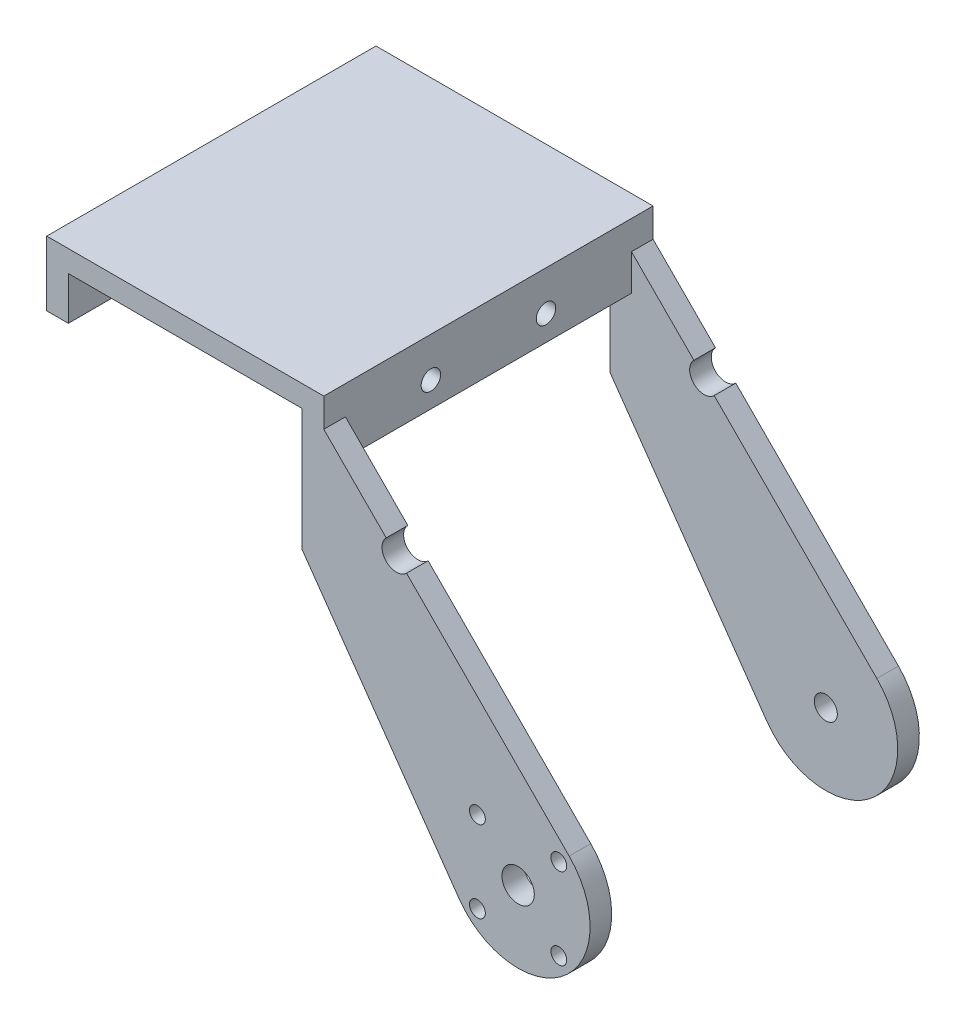
ISO-10303-21;
HEADER;
FILE_DESCRIPTION(('STEP AP214'),'2;1');
FILE_NAME('part.step','',(''),(''),'','','');
FILE_SCHEMA(('AUTOMOTIVE_DESIGN { 1 0 10303 214 1 1 1 1 }'));
ENDSEC;
DATA;
#1=APPLICATION_CONTEXT('core data for automotive mechanical design processes');
#2=APPLICATION_PROTOCOL_DEFINITION('international standard','automotive_design',2000,#1);
#3=PRODUCT_CONTEXT('',#1,'mechanical');
#4=PRODUCT('Part','Part','',(#3));
#5=PRODUCT_RELATED_PRODUCT_CATEGORY('part','',(#4));
#6=PRODUCT_DEFINITION_FORMATION('','',#4);
#7=PRODUCT_DEFINITION_CONTEXT('part definition',#1,'design');
#8=PRODUCT_DEFINITION('design','',#6,#7);
#9=PRODUCT_DEFINITION_SHAPE('','',#8);
#10=(LENGTH_UNIT() NAMED_UNIT(*) SI_UNIT(.MILLI.,.METRE.));
#11=(NAMED_UNIT(*) PLANE_ANGLE_UNIT() SI_UNIT($,.RADIAN.));
#12=(NAMED_UNIT(*) SI_UNIT($,.STERADIAN.) SOLID_ANGLE_UNIT());
#13=UNCERTAINTY_MEASURE_WITH_UNIT(LENGTH_MEASURE(1.E-05),#10,'distance_accuracy_value','');
#14=(GEOMETRIC_REPRESENTATION_CONTEXT(3) GLOBAL_UNCERTAINTY_ASSIGNED_CONTEXT((#13)) GLOBAL_UNIT_ASSIGNED_CONTEXT((#10,
#11,#12)) REPRESENTATION_CONTEXT('',''));
#15=CARTESIAN_POINT('',(0.,0.,0.));
#16=DIRECTION('',(0.,0.,1.));
#17=DIRECTION('',(1.,0.,0.));
#18=AXIS2_PLACEMENT_3D('',#15,#16,#17);
#19=CARTESIAN_POINT('',(19.25,-4.,19.875));
#20=DIRECTION('',(0.709355998899242,0.704850386128616,0.));
#21=DIRECTION('',(-0.704850386128616,0.709355998899242,0.));
#22=AXIS2_PLACEMENT_3D('',#19,#20,#21);
#23=PLANE('',#22);
#24=DIRECTION('',(0.,0.,1.));
#25=VECTOR('',#24,1.);
#26=CARTESIAN_POINT('',(27.9249333549964,-12.7303861025267,-27.7034211788351));
#27=LINE('',#26,#25);
#28=CARTESIAN_POINT('',(27.9249333549964,-12.7303861025267,19.875));
#29=VERTEX_POINT('',#28);
#30=CARTESIAN_POINT('',(27.9249333549964,-12.7303861025267,22.875));
#31=VERTEX_POINT('',#30);
#32=EDGE_CURVE('E173',#29,#31,#27,.T.);
#33=ORIENTED_EDGE('',*,*,#32,.F.);
#34=DIRECTION('',(-0.704850386128616,0.709355998899242,0.));
#35=VECTOR('',#34,1.);
#36=CARTESIAN_POINT('',(19.25,-4.,19.875));
#37=LINE('',#36,#35);
#38=CARTESIAN_POINT('',(19.25,-4.,19.875));
#39=VERTEX_POINT('',#38);
#40=EDGE_CURVE('E426',#29,#39,#37,.T.);
#41=ORIENTED_EDGE('',*,*,#40,.T.);
#42=DIRECTION('',(0.,0.,1.));
#43=VECTOR('',#42,1.);
#44=CARTESIAN_POINT('',(19.25,-4.,19.875));
#45=LINE('',#44,#43);
#46=CARTESIAN_POINT('',(19.25,-4.,22.875));
#47=VERTEX_POINT('',#46);
#48=EDGE_CURVE('E193',#39,#47,#45,.T.);
#49=ORIENTED_EDGE('',*,*,#48,.T.);
#50=DIRECTION('',(-0.704850386128616,0.709355998899242,0.));
#51=VECTOR('',#50,1.);
#52=CARTESIAN_POINT('',(19.25,-4.,22.875));
#53=LINE('',#52,#51);
#54=EDGE_CURVE('E185',#31,#47,#53,.T.);
#55=ORIENTED_EDGE('',*,*,#54,.F.);
#56=EDGE_LOOP('',(#33,#41,#49,#55));
#57=FACE_BOUND('',#56,.T.);
#58=ADVANCED_FACE('F36',(#57),#23,.T.);
#59=CARTESIAN_POINT('',(19.25,-4.,-19.875));
#60=DIRECTION('',(-0.709355998899242,-0.704850386128616,0.));
#61=DIRECTION('',(0.704850386128616,-0.709355998899242,0.));
#62=AXIS2_PLACEMENT_3D('',#59,#60,#61);
#63=PLANE('',#62);
#64=DIRECTION('',(-0.704850386128616,0.709355998899242,0.));
#65=VECTOR('',#64,1.);
#66=CARTESIAN_POINT('',(19.25,-4.,-22.875));
#67=LINE('',#66,#65);
#68=CARTESIAN_POINT('',(53.3435599889924,-38.3114961387138,-22.875));
#69=VERTEX_POINT('',#68);
#70=CARTESIAN_POINT('',(30.7443348995109,-15.5678100981236,-22.875));
#71=VERTEX_POINT('',#70);
#72=EDGE_CURVE('E404',#69,#71,#67,.T.);
#73=ORIENTED_EDGE('',*,*,#72,.T.);
#74=DIRECTION('',(0.,0.,1.));
#75=VECTOR('',#74,1.);
#76=CARTESIAN_POINT('',(30.7443348995109,-15.5678100981236,-27.7034211788351));
#77=LINE('',#76,#75);
#78=CARTESIAN_POINT('',(30.7443348995109,-15.5678100981236,-19.875));
#79=VERTEX_POINT('',#78);
#80=EDGE_CURVE('E349',#71,#79,#77,.T.);
#81=ORIENTED_EDGE('',*,*,#80,.T.);
#82=DIRECTION('',(-0.704850386128616,0.709355998899242,0.));
#83=VECTOR('',#82,1.);
#84=CARTESIAN_POINT('',(19.25,-4.,-19.875));
#85=LINE('',#84,#83);
#86=CARTESIAN_POINT('',(53.3435599889924,-38.3114961387138,-19.875));
#87=VERTEX_POINT('',#86);
#88=EDGE_CURVE('E395',#87,#79,#85,.T.);
#89=ORIENTED_EDGE('',*,*,#88,.F.);
#90=DIRECTION('',(0.,0.,-1.));
#91=VECTOR('',#90,1.);
#92=CARTESIAN_POINT('',(53.3435599889924,-38.3114961387138,-19.875));
#93=LINE('',#92,#91);
#94=EDGE_CURVE('E415',#87,#69,#93,.T.);
#95=ORIENTED_EDGE('',*,*,#94,.T.);
#96=EDGE_LOOP('',(#73,#81,#89,#95));
#97=FACE_BOUND('',#96,.T.);
#98=ADVANCED_FACE('F322',(#97),#63,.F.);
#99=CARTESIAN_POINT('',(19.25,-9.,0.));
#100=DIRECTION('',(-1.,0.,0.));
#101=DIRECTION('',(0.,0.,1.));
#102=AXIS2_PLACEMENT_3D('',#99,#100,#101);
#103=PLANE('',#102);
#104=CARTESIAN_POINT('',(19.25,-5.5,-8.));
#105=DIRECTION('',(-1.,0.,0.));
#106=DIRECTION('',(0.,0.,1.));
#107=AXIS2_PLACEMENT_3D('',#104,#105,#106);
#108=CIRCLE('',#107,1.35);
#109=CARTESIAN_POINT('',(19.25,-5.5,-6.65));
#110=VERTEX_POINT('',#109);
#111=EDGE_CURVE('E246',#110,#110,#108,.F.);
#112=ORIENTED_EDGE('',*,*,#111,.F.);
#113=EDGE_LOOP('',(#112));
#114=FACE_BOUND('',#113,.T.);
#115=CARTESIAN_POINT('',(19.25,-5.5,8.));
#116=DIRECTION('',(-1.,0.,0.));
#117=DIRECTION('',(0.,0.,1.));
#118=AXIS2_PLACEMENT_3D('',#115,#116,#117);
#119=CIRCLE('',#118,1.35);
#120=CARTESIAN_POINT('',(19.25,-5.5,9.35));
#121=VERTEX_POINT('',#120);
#122=EDGE_CURVE('E234',#121,#121,#119,.T.);
#123=ORIENTED_EDGE('',*,*,#122,.T.);
#124=EDGE_LOOP('',(#123));
#125=FACE_BOUND('',#124,.T.);
#126=DIRECTION('',(0.,0.,-1.));
#127=VECTOR('',#126,1.);
#128=CARTESIAN_POINT('',(19.25,-4.,-19.875));
#129=LINE('',#128,#127);
#130=CARTESIAN_POINT('',(19.25,-4.,-19.875));
#131=VERTEX_POINT('',#130);
#132=CARTESIAN_POINT('',(19.25,-4.,-22.875));
#133=VERTEX_POINT('',#132);
#134=EDGE_CURVE('E403',#131,#133,#129,.T.);
#135=ORIENTED_EDGE('',*,*,#134,.T.);
#136=DIRECTION('',(0.,1.,0.));
#137=VECTOR('',#136,1.);
#138=CARTESIAN_POINT('',(19.25,-20.,-22.875));
#139=LINE('',#138,#137);
#140=CARTESIAN_POINT('',(19.25,0.,-22.875));
#141=VERTEX_POINT('',#140);
#142=EDGE_CURVE('E223',#133,#141,#139,.T.);
#143=ORIENTED_EDGE('',*,*,#142,.T.);
#144=DIRECTION('',(0.,0.,1.));
#145=VECTOR('',#144,1.);
#146=CARTESIAN_POINT('',(19.25,0.,0.));
#147=LINE('',#146,#145);
#148=CARTESIAN_POINT('',(19.25,0.,22.875));
#149=VERTEX_POINT('',#148);
#150=EDGE_CURVE('E255',#141,#149,#147,.T.);
#151=ORIENTED_EDGE('',*,*,#150,.T.);
#152=DIRECTION('',(0.,1.,0.));
#153=VECTOR('',#152,1.);
#154=CARTESIAN_POINT('',(19.25,-20.,22.875));
#155=LINE('',#154,#153);
#156=EDGE_CURVE('E213',#47,#149,#155,.T.);
#157=ORIENTED_EDGE('',*,*,#156,.F.);
#158=ORIENTED_EDGE('',*,*,#48,.F.);
#159=DIRECTION('',(0.,1.,0.));
#160=VECTOR('',#159,1.);
#161=CARTESIAN_POINT('',(19.25,-9.,19.875));
#162=LINE('',#161,#160);
#163=CARTESIAN_POINT('',(19.25,-9.,19.875));
#164=VERTEX_POINT('',#163);
#165=EDGE_CURVE('E202',#164,#39,#162,.T.);
#166=ORIENTED_EDGE('',*,*,#165,.F.);
#167=DIRECTION('',(0.,0.,1.));
#168=VECTOR('',#167,1.);
#169=CARTESIAN_POINT('',(19.25,-9.,0.));
#170=LINE('',#169,#168);
#171=CARTESIAN_POINT('',(19.25,-9.,-19.875));
#172=VERTEX_POINT('',#171);
#173=EDGE_CURVE('E258',#172,#164,#170,.T.);
#174=ORIENTED_EDGE('',*,*,#173,.F.);
#175=DIRECTION('',(0.,-1.,0.));
#176=VECTOR('',#175,1.);
#177=CARTESIAN_POINT('',(19.25,-9.,-19.875));
#178=LINE('',#177,#176);
#179=EDGE_CURVE('E414',#131,#172,#178,.T.);
#180=ORIENTED_EDGE('',*,*,#179,.F.);
#181=EDGE_LOOP('',(#135,#143,#151,#157,#158,#166,#174,#180));
#182=FACE_BOUND('',#181,.T.);
#183=ADVANCED_FACE('F328',(#114,#125,#182),#103,.F.);
#184=CARTESIAN_POINT('',(0.,-3.,22.875));
#185=DIRECTION('',(0.,0.,-1.));
#186=DIRECTION('',(-1.,0.,0.));
#187=AXIS2_PLACEMENT_3D('',#184,#185,#186);
#188=PLANE('',#187);
#189=CARTESIAN_POINT('',(51.9068542494925,-51.0168542494923,22.875));
#190=DIRECTION('',(0.,0.,1.));
#191=DIRECTION('',(0.,-1.,0.));
#192=AXIS2_PLACEMENT_3D('',#189,#190,#191);
#193=CIRCLE('',#192,1.1);
#194=CARTESIAN_POINT('',(51.9068542494925,-52.1168542494923,22.875));
#195=VERTEX_POINT('',#194);
#196=EDGE_CURVE('E358',#195,#195,#193,.T.);
#197=ORIENTED_EDGE('',*,*,#196,.F.);
#198=EDGE_LOOP('',(#197));
#199=FACE_BOUND('',#198,.T.);
#200=CARTESIAN_POINT('',(40.5931457505076,-39.7031457505077,22.875));
#201=DIRECTION('',(0.,0.,1.));
#202=DIRECTION('',(0.,1.,0.));
#203=AXIS2_PLACEMENT_3D('',#200,#201,#202);
#204=CIRCLE('',#203,1.1);
#205=CARTESIAN_POINT('',(40.5931457505076,-38.6031457505077,22.875));
#206=VERTEX_POINT('',#205);
#207=EDGE_CURVE('E366',#206,#206,#204,.T.);
#208=ORIENTED_EDGE('',*,*,#207,.F.);
#209=EDGE_LOOP('',(#208));
#210=FACE_BOUND('',#209,.T.);
#211=CARTESIAN_POINT('',(40.5931457505076,-51.0168542494924,22.875));
#212=DIRECTION('',(0.,0.,1.));
#213=DIRECTION('',(-1.,0.,0.));
#214=AXIS2_PLACEMENT_3D('',#211,#212,#213);
#215=CIRCLE('',#214,1.1);
#216=CARTESIAN_POINT('',(39.4931457505076,-51.0168542494924,22.875));
#217=VERTEX_POINT('',#216);
#218=EDGE_CURVE('E359',#217,#217,#215,.T.);
#219=ORIENTED_EDGE('',*,*,#218,.F.);
#220=EDGE_LOOP('',(#219));
#221=FACE_BOUND('',#220,.T.);
#222=CARTESIAN_POINT('',(46.25,-45.36,22.875));
#223=DIRECTION('',(0.,0.,1.));
#224=DIRECTION('',(1.,0.,0.));
#225=AXIS2_PLACEMENT_3D('',#222,#223,#224);
#226=CIRCLE('',#225,2.25);
#227=CARTESIAN_POINT('',(48.5,-45.36,22.875));
#228=VERTEX_POINT('',#227);
#229=EDGE_CURVE('E383',#228,#228,#226,.T.);
#230=ORIENTED_EDGE('',*,*,#229,.F.);
#231=EDGE_LOOP('',(#230));
#232=FACE_BOUND('',#231,.T.);
#233=CARTESIAN_POINT('',(51.9068542494924,-39.7031457505076,22.875));
#234=DIRECTION('',(0.,0.,1.));
#235=DIRECTION('',(1.,0.,0.));
#236=AXIS2_PLACEMENT_3D('',#233,#234,#235);
#237=CIRCLE('',#236,1.1);
#238=CARTESIAN_POINT('',(53.0068542494924,-39.7031457505076,22.875));
#239=VERTEX_POINT('',#238);
#240=EDGE_CURVE('E382',#239,#239,#237,.T.);
#241=ORIENTED_EDGE('',*,*,#240,.F.);
#242=EDGE_LOOP('',(#241));
#243=FACE_BOUND('',#242,.T.);
#244=CARTESIAN_POINT('',(53.3435599889924,-38.3114961387138,22.875));
#245=VERTEX_POINT('',#244);
#246=CARTESIAN_POINT('',(30.7443348995109,-15.5678100981236,22.875));
#247=VERTEX_POINT('',#246);
#248=EDGE_CURVE('E189',#245,#247,#53,.T.);
#249=ORIENTED_EDGE('',*,*,#248,.T.);
#250=CARTESIAN_POINT('',(29.3346341272536,-14.1490981003251,22.875));
#251=DIRECTION('',(0.,0.,1.));
#252=DIRECTION('',(1.,0.,0.));
#253=AXIS2_PLACEMENT_3D('',#250,#251,#252);
#254=CIRCLE('',#253,2.);
#255=EDGE_CURVE('E53',#31,#247,#254,.T.);
#256=ORIENTED_EDGE('',*,*,#255,.F.);
#257=ORIENTED_EDGE('',*,*,#54,.T.);
#258=ORIENTED_EDGE('',*,*,#156,.T.);
#259=DIRECTION('',(-1.,0.,0.));
#260=VECTOR('',#259,1.);
#261=CARTESIAN_POINT('',(0.,0.,22.875));
#262=LINE('',#261,#260);
#263=CARTESIAN_POINT('',(-19.25,0.,22.875));
#264=VERTEX_POINT('',#263);
#265=EDGE_CURVE('E40',#149,#264,#262,.T.);
#266=ORIENTED_EDGE('',*,*,#265,.T.);
#267=DIRECTION('',(0.,1.,0.));
#268=VECTOR('',#267,1.);
#269=CARTESIAN_POINT('',(-19.25,-9.,22.875));
#270=LINE('',#269,#268);
#271=CARTESIAN_POINT('',(-19.25,-9.,22.875));
#272=VERTEX_POINT('',#271);
#273=EDGE_CURVE('E287',#272,#264,#270,.T.);
#274=ORIENTED_EDGE('',*,*,#273,.F.);
#275=DIRECTION('',(-1.,0.,0.));
#276=VECTOR('',#275,1.);
#277=CARTESIAN_POINT('',(0.,-9.,22.875));
#278=LINE('',#277,#276);
#279=CARTESIAN_POINT('',(-16.25,-9.,22.875));
#280=VERTEX_POINT('',#279);
#281=EDGE_CURVE('E275',#280,#272,#278,.T.);
#282=ORIENTED_EDGE('',*,*,#281,.F.);
#283=DIRECTION('',(0.,1.,0.));
#284=VECTOR('',#283,1.);
#285=CARTESIAN_POINT('',(-16.25,-9.,22.875));
#286=LINE('',#285,#284);
#287=CARTESIAN_POINT('',(-16.25,-3.,22.875));
#288=VERTEX_POINT('',#287);
#289=EDGE_CURVE('E285',#280,#288,#286,.T.);
#290=ORIENTED_EDGE('',*,*,#289,.T.);
#291=DIRECTION('',(-1.,0.,0.));
#292=VECTOR('',#291,1.);
#293=CARTESIAN_POINT('',(0.,-3.,22.875));
#294=LINE('',#293,#292);
#295=CARTESIAN_POINT('',(16.25,-3.,22.875));
#296=VERTEX_POINT('',#295);
#297=EDGE_CURVE('E11',#296,#288,#294,.T.);
#298=ORIENTED_EDGE('',*,*,#297,.F.);
#299=DIRECTION('',(0.,1.,0.));
#300=VECTOR('',#299,1.);
#301=CARTESIAN_POINT('',(16.25,-20.,22.875));
#302=LINE('',#301,#300);
#303=CARTESIAN_POINT('',(16.25,-20.,22.875));
#304=VERTEX_POINT('',#303);
#305=EDGE_CURVE('E216',#304,#296,#302,.T.);
#306=ORIENTED_EDGE('',*,*,#305,.F.);
#307=DIRECTION('',(0.57419439641508,-0.818718996436214,0.));
#308=VECTOR('',#307,1.);
#309=CARTESIAN_POINT('',(16.25,-20.,22.875));
#310=LINE('',#309,#308);
#311=CARTESIAN_POINT('',(38.0628100356379,-51.1019439641508,22.875));
#312=VERTEX_POINT('',#311);
#313=EDGE_CURVE('E197',#304,#312,#310,.T.);
#314=ORIENTED_EDGE('',*,*,#313,.T.);
#315=CARTESIAN_POINT('',(46.25,-45.36,22.875));
#316=DIRECTION('',(0.,0.,1.));
#317=DIRECTION('',(1.,0.,0.));
#318=AXIS2_PLACEMENT_3D('',#315,#316,#317);
#319=CIRCLE('',#318,10.);
#320=EDGE_CURVE('E194',#312,#245,#319,.T.);
#321=ORIENTED_EDGE('',*,*,#320,.T.);
#322=EDGE_LOOP('',(#249,#256,#257,#258,#266,#274,#282,#290,#298,#306,#314,#321));
#323=FACE_BOUND('',#322,.T.);
#324=ADVANCED_FACE('F184',(#199,#210,#221,#232,#243,#323),#188,.F.);
#325=CARTESIAN_POINT('',(0.,-3.,-22.875));
#326=DIRECTION('',(0.,0.,-1.));
#327=DIRECTION('',(-1.,0.,0.));
#328=AXIS2_PLACEMENT_3D('',#325,#326,#327);
#329=PLANE('',#328);
#330=CARTESIAN_POINT('',(29.3346341272536,-14.1490981003251,-22.875));
#331=DIRECTION('',(0.,0.,-1.));
#332=DIRECTION('',(-1.,0.,0.));
#333=AXIS2_PLACEMENT_3D('',#330,#331,#332);
#334=CIRCLE('',#333,2.);
#335=CARTESIAN_POINT('',(27.9249333549964,-12.7303861025267,-22.875));
#336=VERTEX_POINT('',#335);
#337=EDGE_CURVE('E61',#336,#71,#334,.F.);
#338=ORIENTED_EDGE('',*,*,#337,.T.);
#339=ORIENTED_EDGE('',*,*,#72,.F.);
#340=CARTESIAN_POINT('',(46.25,-45.36,-22.875));
#341=DIRECTION('',(0.,0.,1.));
#342=DIRECTION('',(1.,0.,0.));
#343=AXIS2_PLACEMENT_3D('',#340,#341,#342);
#344=CIRCLE('',#343,10.);
#345=CARTESIAN_POINT('',(38.0628100356379,-51.1019439641508,-22.875));
#346=VERTEX_POINT('',#345);
#347=EDGE_CURVE('E407',#346,#69,#344,.T.);
#348=ORIENTED_EDGE('',*,*,#347,.F.);
#349=DIRECTION('',(0.57419439641508,-0.818718996436214,0.));
#350=VECTOR('',#349,1.);
#351=CARTESIAN_POINT('',(16.25,-20.,-22.875));
#352=LINE('',#351,#350);
#353=CARTESIAN_POINT('',(16.25,-20.,-22.875));
#354=VERTEX_POINT('',#353);
#355=EDGE_CURVE('E409',#354,#346,#352,.T.);
#356=ORIENTED_EDGE('',*,*,#355,.F.);
#357=DIRECTION('',(0.,1.,0.));
#358=VECTOR('',#357,1.);
#359=CARTESIAN_POINT('',(16.25,-20.,-22.875));
#360=LINE('',#359,#358);
#361=CARTESIAN_POINT('',(16.25,-3.,-22.875));
#362=VERTEX_POINT('',#361);
#363=EDGE_CURVE('E228',#354,#362,#360,.T.);
#364=ORIENTED_EDGE('',*,*,#363,.T.);
#365=DIRECTION('',(-1.,0.,0.));
#366=VECTOR('',#365,1.);
#367=CARTESIAN_POINT('',(0.,-3.,-22.875));
#368=LINE('',#367,#366);
#369=CARTESIAN_POINT('',(-16.25,-3.,-22.875));
#370=VERTEX_POINT('',#369);
#371=EDGE_CURVE('E294',#362,#370,#368,.T.);
#372=ORIENTED_EDGE('',*,*,#371,.T.);
#373=DIRECTION('',(0.,1.,0.));
#374=VECTOR('',#373,1.);
#375=CARTESIAN_POINT('',(-16.25,-9.,-22.875));
#376=LINE('',#375,#374);
#377=CARTESIAN_POINT('',(-16.25,-9.,-22.875));
#378=VERTEX_POINT('',#377);
#379=EDGE_CURVE('E282',#378,#370,#376,.T.);
#380=ORIENTED_EDGE('',*,*,#379,.F.);
#381=DIRECTION('',(-1.,0.,0.));
#382=VECTOR('',#381,1.);
#383=CARTESIAN_POINT('',(0.,-9.,-22.875));
#384=LINE('',#383,#382);
#385=CARTESIAN_POINT('',(-19.25,-9.,-22.875));
#386=VERTEX_POINT('',#385);
#387=EDGE_CURVE('E269',#378,#386,#384,.T.);
#388=ORIENTED_EDGE('',*,*,#387,.T.);
#389=DIRECTION('',(0.,1.,0.));
#390=VECTOR('',#389,1.);
#391=CARTESIAN_POINT('',(-19.25,-9.,-22.875));
#392=LINE('',#391,#390);
#393=CARTESIAN_POINT('',(-19.25,0.,-22.875));
#394=VERTEX_POINT('',#393);
#395=EDGE_CURVE('E279',#386,#394,#392,.T.);
#396=ORIENTED_EDGE('',*,*,#395,.T.);
#397=DIRECTION('',(-1.,0.,0.));
#398=VECTOR('',#397,1.);
#399=CARTESIAN_POINT('',(0.,0.,-22.875));
#400=LINE('',#399,#398);
#401=EDGE_CURVE('E284',#141,#394,#400,.T.);
#402=ORIENTED_EDGE('',*,*,#401,.F.);
#403=ORIENTED_EDGE('',*,*,#142,.F.);
#404=EDGE_CURVE('E390',#336,#133,#67,.T.);
#405=ORIENTED_EDGE('',*,*,#404,.F.);
#406=EDGE_LOOP('',(#338,#339,#348,#356,#364,#372,#380,#388,#396,#402,#403,#405));
#407=FACE_BOUND('',#406,.T.);
#408=CARTESIAN_POINT('',(46.25,-45.36,-22.875));
#409=DIRECTION('',(0.,0.,-1.));
#410=DIRECTION('',(-1.,0.,0.));
#411=AXIS2_PLACEMENT_3D('',#408,#409,#410);
#412=CIRCLE('',#411,1.6);
#413=CARTESIAN_POINT('',(44.65,-45.36,-22.875));
#414=VERTEX_POINT('',#413);
#415=EDGE_CURVE('E372',#414,#414,#412,.T.);
#416=ORIENTED_EDGE('',*,*,#415,.F.);
#417=EDGE_LOOP('',(#416));
#418=FACE_BOUND('',#417,.T.);
#419=ADVANCED_FACE('F38',(#407,#418),#329,.T.);
#420=CARTESIAN_POINT('',(0.,-3.,0.));
#421=DIRECTION('',(0.,1.,0.));
#422=DIRECTION('',(0.,0.,1.));
#423=AXIS2_PLACEMENT_3D('',#420,#421,#422);
#424=PLANE('',#423);
#425=DIRECTION('',(0.,0.,1.));
#426=VECTOR('',#425,1.);
#427=CARTESIAN_POINT('',(16.25,-3.,0.));
#428=LINE('',#427,#426);
#429=EDGE_CURVE('E292',#362,#296,#428,.T.);
#430=ORIENTED_EDGE('',*,*,#429,.T.);
#431=ORIENTED_EDGE('',*,*,#297,.T.);
#432=DIRECTION('',(0.,0.,1.));
#433=VECTOR('',#432,1.);
#434=CARTESIAN_POINT('',(-16.25,-3.,0.));
#435=LINE('',#434,#433);
#436=EDGE_CURVE('E45',#370,#288,#435,.T.);
#437=ORIENTED_EDGE('',*,*,#436,.F.);
#438=ORIENTED_EDGE('',*,*,#371,.F.);
#439=EDGE_LOOP('',(#430,#431,#437,#438));
#440=FACE_BOUND('',#439,.T.);
#441=ADVANCED_FACE('F311',(#440),#424,.F.);
#442=CARTESIAN_POINT('',(0.,0.,0.));
#443=DIRECTION('',(0.,1.,0.));
#444=DIRECTION('',(0.,0.,1.));
#445=AXIS2_PLACEMENT_3D('',#442,#443,#444);
#446=PLANE('',#445);
#447=ORIENTED_EDGE('',*,*,#265,.F.);
#448=ORIENTED_EDGE('',*,*,#150,.F.);
#449=ORIENTED_EDGE('',*,*,#401,.T.);
#450=DIRECTION('',(0.,0.,1.));
#451=VECTOR('',#450,1.);
#452=CARTESIAN_POINT('',(-19.25,0.,0.));
#453=LINE('',#452,#451);
#454=EDGE_CURVE('E266',#394,#264,#453,.T.);
#455=ORIENTED_EDGE('',*,*,#454,.T.);
#456=EDGE_LOOP('',(#447,#448,#449,#455));
#457=FACE_BOUND('',#456,.T.);
#458=ADVANCED_FACE('F308',(#457),#446,.T.);
#459=CARTESIAN_POINT('',(-16.25,-9.,0.));
#460=DIRECTION('',(-1.,0.,0.));
#461=DIRECTION('',(0.,0.,1.));
#462=AXIS2_PLACEMENT_3D('',#459,#460,#461);
#463=PLANE('',#462);
#464=CARTESIAN_POINT('',(-16.25,-5.5,8.));
#465=DIRECTION('',(-1.,0.,0.));
#466=DIRECTION('',(0.,0.,1.));
#467=AXIS2_PLACEMENT_3D('',#464,#465,#466);
#468=CIRCLE('',#467,1.35);
#469=CARTESIAN_POINT('',(-16.25,-5.5,9.35));
#470=VERTEX_POINT('',#469);
#471=EDGE_CURVE('E240',#470,#470,#468,.F.);
#472=ORIENTED_EDGE('',*,*,#471,.F.);
#473=EDGE_LOOP('',(#472));
#474=FACE_BOUND('',#473,.T.);
#475=CARTESIAN_POINT('',(-16.25,-5.5,-8.));
#476=DIRECTION('',(-1.,0.,0.));
#477=DIRECTION('',(0.,0.,1.));
#478=AXIS2_PLACEMENT_3D('',#475,#476,#477);
#479=CIRCLE('',#478,1.35);
#480=CARTESIAN_POINT('',(-16.25,-5.5,-6.65));
#481=VERTEX_POINT('',#480);
#482=EDGE_CURVE('E252',#481,#481,#479,.T.);
#483=ORIENTED_EDGE('',*,*,#482,.T.);
#484=EDGE_LOOP('',(#483));
#485=FACE_BOUND('',#484,.T.);
#486=ORIENTED_EDGE('',*,*,#436,.T.);
#487=ORIENTED_EDGE('',*,*,#289,.F.);
#488=DIRECTION('',(0.,0.,1.));
#489=VECTOR('',#488,1.);
#490=CARTESIAN_POINT('',(-16.25,-9.,0.));
#491=LINE('',#490,#489);
#492=EDGE_CURVE('E277',#378,#280,#491,.T.);
#493=ORIENTED_EDGE('',*,*,#492,.F.);
#494=ORIENTED_EDGE('',*,*,#379,.T.);
#495=EDGE_LOOP('',(#486,#487,#493,#494));
#496=FACE_BOUND('',#495,.T.);
#497=ADVANCED_FACE('F310',(#474,#485,#496),#463,.F.);
#498=CARTESIAN_POINT('',(-19.25,-9.,0.));
#499=DIRECTION('',(-1.,0.,0.));
#500=DIRECTION('',(0.,0.,1.));
#501=AXIS2_PLACEMENT_3D('',#498,#499,#500);
#502=PLANE('',#501);
#503=CARTESIAN_POINT('',(-19.25,-5.5,8.));
#504=DIRECTION('',(1.,0.,0.));
#505=DIRECTION('',(0.,0.,-1.));
#506=AXIS2_PLACEMENT_3D('',#503,#504,#505);
#507=CIRCLE('',#506,1.35);
#508=CARTESIAN_POINT('',(-19.25,-5.5,6.65));
#509=VERTEX_POINT('',#508);
#510=EDGE_CURVE('E227',#509,#509,#507,.T.);
#511=ORIENTED_EDGE('',*,*,#510,.T.);
#512=EDGE_LOOP('',(#511));
#513=FACE_BOUND('',#512,.T.);
#514=CARTESIAN_POINT('',(-19.25,-5.5,-8.));
#515=DIRECTION('',(-1.,0.,0.));
#516=DIRECTION('',(0.,0.,1.));
#517=AXIS2_PLACEMENT_3D('',#514,#515,#516);
#518=CIRCLE('',#517,1.35);
#519=CARTESIAN_POINT('',(-19.25,-5.5,-6.65));
#520=VERTEX_POINT('',#519);
#521=EDGE_CURVE('E243',#520,#520,#518,.T.);
#522=ORIENTED_EDGE('',*,*,#521,.F.);
#523=EDGE_LOOP('',(#522));
#524=FACE_BOUND('',#523,.T.);
#525=ORIENTED_EDGE('',*,*,#454,.F.);
#526=ORIENTED_EDGE('',*,*,#395,.F.);
#527=DIRECTION('',(0.,0.,1.));
#528=VECTOR('',#527,1.);
#529=CARTESIAN_POINT('',(-19.25,-9.,0.));
#530=LINE('',#529,#528);
#531=EDGE_CURVE('E272',#386,#272,#530,.T.);
#532=ORIENTED_EDGE('',*,*,#531,.T.);
#533=ORIENTED_EDGE('',*,*,#273,.T.);
#534=EDGE_LOOP('',(#525,#526,#532,#533));
#535=FACE_BOUND('',#534,.T.);
#536=ADVANCED_FACE('F306',(#513,#524,#535),#502,.T.);
#537=CARTESIAN_POINT('',(0.,-9.,0.));
#538=DIRECTION('',(0.,1.,0.));
#539=DIRECTION('',(0.,0.,1.));
#540=AXIS2_PLACEMENT_3D('',#537,#538,#539);
#541=PLANE('',#540);
#542=ORIENTED_EDGE('',*,*,#387,.F.);
#543=ORIENTED_EDGE('',*,*,#492,.T.);
#544=ORIENTED_EDGE('',*,*,#281,.T.);
#545=ORIENTED_EDGE('',*,*,#531,.F.);
#546=EDGE_LOOP('',(#542,#543,#544,#545));
#547=FACE_BOUND('',#546,.T.);
#548=ADVANCED_FACE('F448',(#547),#541,.F.);
#549=CARTESIAN_POINT('',(16.25,-9.,0.));
#550=DIRECTION('',(-1.,0.,0.));
#551=DIRECTION('',(0.,0.,1.));
#552=AXIS2_PLACEMENT_3D('',#549,#550,#551);
#553=PLANE('',#552);
#554=CARTESIAN_POINT('',(16.25,-5.5,8.));
#555=DIRECTION('',(-1.,0.,0.));
#556=DIRECTION('',(0.,0.,1.));
#557=AXIS2_PLACEMENT_3D('',#554,#555,#556);
#558=CIRCLE('',#557,1.35);
#559=CARTESIAN_POINT('',(16.25,-5.5,9.35));
#560=VERTEX_POINT('',#559);
#561=EDGE_CURVE('E237',#560,#560,#558,.F.);
#562=ORIENTED_EDGE('',*,*,#561,.T.);
#563=EDGE_LOOP('',(#562));
#564=FACE_BOUND('',#563,.T.);
#565=CARTESIAN_POINT('',(16.25,-5.5,-8.));
#566=DIRECTION('',(-1.,0.,0.));
#567=DIRECTION('',(0.,0.,1.));
#568=AXIS2_PLACEMENT_3D('',#565,#566,#567);
#569=CIRCLE('',#568,1.35);
#570=CARTESIAN_POINT('',(16.25,-5.5,-6.65));
#571=VERTEX_POINT('',#570);
#572=EDGE_CURVE('E249',#571,#571,#569,.T.);
#573=ORIENTED_EDGE('',*,*,#572,.F.);
#574=EDGE_LOOP('',(#573));
#575=FACE_BOUND('',#574,.T.);
#576=DIRECTION('',(0.,0.,1.));
#577=VECTOR('',#576,1.);
#578=CARTESIAN_POINT('',(16.25,-9.,0.));
#579=LINE('',#578,#577);
#580=CARTESIAN_POINT('',(16.25,-9.,-19.875));
#581=VERTEX_POINT('',#580);
#582=CARTESIAN_POINT('',(16.25,-9.,19.875));
#583=VERTEX_POINT('',#582);
#584=EDGE_CURVE('E263',#581,#583,#579,.T.);
#585=ORIENTED_EDGE('',*,*,#584,.T.);
#586=DIRECTION('',(0.,1.,0.));
#587=VECTOR('',#586,1.);
#588=CARTESIAN_POINT('',(16.25,-20.,19.875));
#589=LINE('',#588,#587);
#590=CARTESIAN_POINT('',(16.25,-20.,19.875));
#591=VERTEX_POINT('',#590);
#592=EDGE_CURVE('E212',#591,#583,#589,.T.);
#593=ORIENTED_EDGE('',*,*,#592,.F.);
#594=DIRECTION('',(0.,0.,1.));
#595=VECTOR('',#594,1.);
#596=CARTESIAN_POINT('',(16.25,-20.,0.));
#597=LINE('',#596,#595);
#598=EDGE_CURVE('E210',#591,#304,#597,.T.);
#599=ORIENTED_EDGE('',*,*,#598,.T.);
#600=ORIENTED_EDGE('',*,*,#305,.T.);
#601=ORIENTED_EDGE('',*,*,#429,.F.);
#602=ORIENTED_EDGE('',*,*,#363,.F.);
#603=DIRECTION('',(0.,0.,1.));
#604=VECTOR('',#603,1.);
#605=CARTESIAN_POINT('',(16.25,-20.,0.));
#606=LINE('',#605,#604);
#607=CARTESIAN_POINT('',(16.25,-20.,-19.875));
#608=VERTEX_POINT('',#607);
#609=EDGE_CURVE('E215',#354,#608,#606,.T.);
#610=ORIENTED_EDGE('',*,*,#609,.T.);
#611=DIRECTION('',(0.,1.,0.));
#612=VECTOR('',#611,1.);
#613=CARTESIAN_POINT('',(16.25,-20.,-19.875));
#614=LINE('',#613,#612);
#615=EDGE_CURVE('E224',#608,#581,#614,.T.);
#616=ORIENTED_EDGE('',*,*,#615,.T.);
#617=EDGE_LOOP('',(#585,#593,#599,#600,#601,#602,#610,#616));
#618=FACE_BOUND('',#617,.T.);
#619=ADVANCED_FACE('F457',(#564,#575,#618),#553,.T.);
#620=CARTESIAN_POINT('',(0.,-9.,0.));
#621=DIRECTION('',(0.,1.,0.));
#622=DIRECTION('',(0.,0.,1.));
#623=AXIS2_PLACEMENT_3D('',#620,#621,#622);
#624=PLANE('',#623);
#625=DIRECTION('',(-1.,0.,0.));
#626=VECTOR('',#625,1.);
#627=CARTESIAN_POINT('',(0.,-9.,19.875));
#628=LINE('',#627,#626);
#629=EDGE_CURVE('E256',#164,#583,#628,.T.);
#630=ORIENTED_EDGE('',*,*,#629,.T.);
#631=ORIENTED_EDGE('',*,*,#584,.F.);
#632=DIRECTION('',(-1.,0.,0.));
#633=VECTOR('',#632,1.);
#634=CARTESIAN_POINT('',(0.,-9.,-19.875));
#635=LINE('',#634,#633);
#636=EDGE_CURVE('E261',#172,#581,#635,.T.);
#637=ORIENTED_EDGE('',*,*,#636,.F.);
#638=ORIENTED_EDGE('',*,*,#173,.T.);
#639=EDGE_LOOP('',(#630,#631,#637,#638));
#640=FACE_BOUND('',#639,.T.);
#641=ADVANCED_FACE('F461',(#640),#624,.F.);
#642=CARTESIAN_POINT('',(23.0683766184074,-5.5,-8.));
#643=DIRECTION('',(-1.,0.,0.));
#644=DIRECTION('',(0.,0.,1.));
#645=AXIS2_PLACEMENT_3D('',#642,#643,#644);
#646=CYLINDRICAL_SURFACE('',#645,1.35);
#647=ORIENTED_EDGE('',*,*,#572,.T.);
#648=EDGE_LOOP('',(#647));
#649=FACE_BOUND('',#648,.T.);
#650=ORIENTED_EDGE('',*,*,#111,.T.);
#651=EDGE_LOOP('',(#650));
#652=FACE_BOUND('',#651,.T.);
#653=ADVANCED_FACE('F660',(#649,#652),#646,.F.);
#654=ORIENTED_EDGE('',*,*,#521,.T.);
#655=EDGE_LOOP('',(#654));
#656=FACE_BOUND('',#655,.T.);
#657=ORIENTED_EDGE('',*,*,#482,.F.);
#658=EDGE_LOOP('',(#657));
#659=FACE_BOUND('',#658,.T.);
#660=ADVANCED_FACE('F723',(#656,#659),#646,.F.);
#661=CARTESIAN_POINT('',(23.0683766184074,-5.5,8.));
#662=DIRECTION('',(-1.,0.,0.));
#663=DIRECTION('',(0.,0.,1.));
#664=AXIS2_PLACEMENT_3D('',#661,#662,#663);
#665=CYLINDRICAL_SURFACE('',#664,1.35);
#666=ORIENTED_EDGE('',*,*,#561,.F.);
#667=EDGE_LOOP('',(#666));
#668=FACE_BOUND('',#667,.T.);
#669=ORIENTED_EDGE('',*,*,#122,.F.);
#670=EDGE_LOOP('',(#669));
#671=FACE_BOUND('',#670,.T.);
#672=ADVANCED_FACE('F713',(#668,#671),#665,.F.);
#673=ORIENTED_EDGE('',*,*,#510,.F.);
#674=EDGE_LOOP('',(#673));
#675=FACE_BOUND('',#674,.T.);
#676=ORIENTED_EDGE('',*,*,#471,.T.);
#677=EDGE_LOOP('',(#676));
#678=FACE_BOUND('',#677,.T.);
#679=ADVANCED_FACE('F589',(#675,#678),#665,.F.);
#680=CARTESIAN_POINT('',(0.,-20.,-19.875));
#681=DIRECTION('',(0.,0.,-1.));
#682=DIRECTION('',(-1.,0.,0.));
#683=AXIS2_PLACEMENT_3D('',#680,#681,#682);
#684=PLANE('',#683);
#685=CARTESIAN_POINT('',(46.25,-45.36,-19.875));
#686=DIRECTION('',(0.,0.,-1.));
#687=DIRECTION('',(-1.,0.,0.));
#688=AXIS2_PLACEMENT_3D('',#685,#686,#687);
#689=CIRCLE('',#688,1.6);
#690=CARTESIAN_POINT('',(44.65,-45.36,-19.875));
#691=VERTEX_POINT('',#690);
#692=EDGE_CURVE('E379',#691,#691,#689,.F.);
#693=ORIENTED_EDGE('',*,*,#692,.F.);
#694=EDGE_LOOP('',(#693));
#695=FACE_BOUND('',#694,.T.);
#696=ORIENTED_EDGE('',*,*,#88,.T.);
#697=CARTESIAN_POINT('',(29.3346341272536,-14.1490981003251,-19.875));
#698=DIRECTION('',(0.,0.,-1.));
#699=DIRECTION('',(-1.,0.,0.));
#700=AXIS2_PLACEMENT_3D('',#697,#698,#699);
#701=CIRCLE('',#700,2.);
#702=CARTESIAN_POINT('',(27.9249333549964,-12.7303861025267,-19.875));
#703=VERTEX_POINT('',#702);
#704=EDGE_CURVE('E355',#79,#703,#701,.T.);
#705=ORIENTED_EDGE('',*,*,#704,.T.);
#706=EDGE_CURVE('E399',#703,#131,#85,.T.);
#707=ORIENTED_EDGE('',*,*,#706,.T.);
#708=ORIENTED_EDGE('',*,*,#179,.T.);
#709=ORIENTED_EDGE('',*,*,#636,.T.);
#710=ORIENTED_EDGE('',*,*,#615,.F.);
#711=DIRECTION('',(0.57419439641508,-0.818718996436214,0.));
#712=VECTOR('',#711,1.);
#713=CARTESIAN_POINT('',(16.25,-20.,-19.875));
#714=LINE('',#713,#712);
#715=CARTESIAN_POINT('',(38.0628100356379,-51.1019439641508,-19.875));
#716=VERTEX_POINT('',#715);
#717=EDGE_CURVE('E401',#608,#716,#714,.T.);
#718=ORIENTED_EDGE('',*,*,#717,.T.);
#719=CARTESIAN_POINT('',(46.25,-45.36,-19.875));
#720=DIRECTION('',(0.,0.,1.));
#721=DIRECTION('',(1.,0.,0.));
#722=AXIS2_PLACEMENT_3D('',#719,#720,#721);
#723=CIRCLE('',#722,10.);
#724=EDGE_CURVE('E398',#716,#87,#723,.T.);
#725=ORIENTED_EDGE('',*,*,#724,.T.);
#726=EDGE_LOOP('',(#696,#705,#707,#708,#709,#710,#718,#725));
#727=FACE_BOUND('',#726,.T.);
#728=ADVANCED_FACE('F343',(#695,#727),#684,.F.);
#729=CARTESIAN_POINT('',(0.,-20.,19.875));
#730=DIRECTION('',(0.,0.,-1.));
#731=DIRECTION('',(-1.,0.,0.));
#732=AXIS2_PLACEMENT_3D('',#729,#730,#731);
#733=PLANE('',#732);
#734=CARTESIAN_POINT('',(29.3346341272536,-14.1490981003251,19.875));
#735=DIRECTION('',(0.,0.,-1.));
#736=DIRECTION('',(-1.,0.,0.));
#737=AXIS2_PLACEMENT_3D('',#734,#735,#736);
#738=CIRCLE('',#737,2.);
#739=CARTESIAN_POINT('',(30.7443348995109,-15.5678100981236,19.875));
#740=VERTEX_POINT('',#739);
#741=EDGE_CURVE('E176',#740,#29,#738,.T.);
#742=ORIENTED_EDGE('',*,*,#741,.F.);
#743=CARTESIAN_POINT('',(53.3435599889924,-38.3114961387138,19.875));
#744=VERTEX_POINT('',#743);
#745=EDGE_CURVE('E207',#744,#740,#37,.T.);
#746=ORIENTED_EDGE('',*,*,#745,.F.);
#747=CARTESIAN_POINT('',(46.25,-45.36,19.875));
#748=DIRECTION('',(0.,0.,1.));
#749=DIRECTION('',(1.,0.,0.));
#750=AXIS2_PLACEMENT_3D('',#747,#748,#749);
#751=CIRCLE('',#750,10.);
#752=CARTESIAN_POINT('',(38.0628100356379,-51.1019439641508,19.875));
#753=VERTEX_POINT('',#752);
#754=EDGE_CURVE('E423',#753,#744,#751,.T.);
#755=ORIENTED_EDGE('',*,*,#754,.F.);
#756=DIRECTION('',(0.57419439641508,-0.818718996436214,0.));
#757=VECTOR('',#756,1.);
#758=CARTESIAN_POINT('',(16.25,-20.,19.875));
#759=LINE('',#758,#757);
#760=EDGE_CURVE('E196',#591,#753,#759,.T.);
#761=ORIENTED_EDGE('',*,*,#760,.F.);
#762=ORIENTED_EDGE('',*,*,#592,.T.);
#763=ORIENTED_EDGE('',*,*,#629,.F.);
#764=ORIENTED_EDGE('',*,*,#165,.T.);
#765=ORIENTED_EDGE('',*,*,#40,.F.);
#766=EDGE_LOOP('',(#742,#746,#755,#761,#762,#763,#764,#765));
#767=FACE_BOUND('',#766,.T.);
#768=CARTESIAN_POINT('',(51.9068542494925,-51.0168542494923,19.875));
#769=DIRECTION('',(0.,0.,-1.));
#770=DIRECTION('',(-1.,0.,0.));
#771=AXIS2_PLACEMENT_3D('',#768,#769,#770);
#772=CIRCLE('',#771,1.1);
#773=CARTESIAN_POINT('',(50.8068542494925,-51.0168542494923,19.875));
#774=VERTEX_POINT('',#773);
#775=EDGE_CURVE('E363',#774,#774,#772,.F.);
#776=ORIENTED_EDGE('',*,*,#775,.T.);
#777=EDGE_LOOP('',(#776));
#778=FACE_BOUND('',#777,.T.);
#779=CARTESIAN_POINT('',(40.5931457505076,-39.7031457505077,19.875));
#780=DIRECTION('',(0.,0.,-1.));
#781=DIRECTION('',(-1.,0.,0.));
#782=AXIS2_PLACEMENT_3D('',#779,#780,#781);
#783=CIRCLE('',#782,1.1);
#784=CARTESIAN_POINT('',(39.4931457505076,-39.7031457505077,19.875));
#785=VERTEX_POINT('',#784);
#786=EDGE_CURVE('E369',#785,#785,#783,.F.);
#787=ORIENTED_EDGE('',*,*,#786,.T.);
#788=EDGE_LOOP('',(#787));
#789=FACE_BOUND('',#788,.T.);
#790=CARTESIAN_POINT('',(40.5931457505076,-51.0168542494924,19.875));
#791=DIRECTION('',(0.,0.,-1.));
#792=DIRECTION('',(-1.,0.,0.));
#793=AXIS2_PLACEMENT_3D('',#790,#791,#792);
#794=CIRCLE('',#793,1.1);
#795=CARTESIAN_POINT('',(39.4931457505076,-51.0168542494924,19.875));
#796=VERTEX_POINT('',#795);
#797=EDGE_CURVE('E362',#796,#796,#794,.F.);
#798=ORIENTED_EDGE('',*,*,#797,.T.);
#799=EDGE_LOOP('',(#798));
#800=FACE_BOUND('',#799,.T.);
#801=CARTESIAN_POINT('',(46.25,-45.36,19.875));
#802=DIRECTION('',(0.,0.,-1.));
#803=DIRECTION('',(-1.,0.,0.));
#804=AXIS2_PLACEMENT_3D('',#801,#802,#803);
#805=CIRCLE('',#804,2.25);
#806=CARTESIAN_POINT('',(44.,-45.36,19.875));
#807=VERTEX_POINT('',#806);
#808=EDGE_CURVE('E386',#807,#807,#805,.F.);
#809=ORIENTED_EDGE('',*,*,#808,.T.);
#810=EDGE_LOOP('',(#809));
#811=FACE_BOUND('',#810,.T.);
#812=CARTESIAN_POINT('',(51.9068542494924,-39.7031457505076,19.875));
#813=DIRECTION('',(0.,0.,-1.));
#814=DIRECTION('',(-1.,0.,0.));
#815=AXIS2_PLACEMENT_3D('',#812,#813,#814);
#816=CIRCLE('',#815,1.1);
#817=CARTESIAN_POINT('',(50.8068542494924,-39.7031457505076,19.875));
#818=VERTEX_POINT('',#817);
#819=EDGE_CURVE('E387',#818,#818,#816,.F.);
#820=ORIENTED_EDGE('',*,*,#819,.T.);
#821=EDGE_LOOP('',(#820));
#822=FACE_BOUND('',#821,.T.);
#823=ADVANCED_FACE('F335',(#767,#778,#789,#800,#811,#822),#733,.T.);
#824=EDGE_CURVE('E347',#740,#247,#77,.T.);
#825=ORIENTED_EDGE('',*,*,#824,.T.);
#826=ORIENTED_EDGE('',*,*,#248,.F.);
#827=DIRECTION('',(0.,0.,1.));
#828=VECTOR('',#827,1.);
#829=CARTESIAN_POINT('',(53.3435599889924,-38.3114961387138,19.875));
#830=LINE('',#829,#828);
#831=EDGE_CURVE('E203',#744,#245,#830,.T.);
#832=ORIENTED_EDGE('',*,*,#831,.F.);
#833=ORIENTED_EDGE('',*,*,#745,.T.);
#834=EDGE_LOOP('',(#825,#826,#832,#833));
#835=FACE_BOUND('',#834,.T.);
#836=ADVANCED_FACE('F324',(#835),#23,.T.);
#837=CARTESIAN_POINT('',(46.25,-45.36,19.875));
#838=DIRECTION('',(0.,0.,1.));
#839=DIRECTION('',(1.,0.,0.));
#840=AXIS2_PLACEMENT_3D('',#837,#838,#839);
#841=CYLINDRICAL_SURFACE('',#840,10.);
#842=ORIENTED_EDGE('',*,*,#320,.F.);
#843=DIRECTION('',(0.,0.,1.));
#844=VECTOR('',#843,1.);
#845=CARTESIAN_POINT('',(38.0628100356379,-51.1019439641508,19.875));
#846=LINE('',#845,#844);
#847=EDGE_CURVE('E205',#753,#312,#846,.T.);
#848=ORIENTED_EDGE('',*,*,#847,.F.);
#849=ORIENTED_EDGE('',*,*,#754,.T.);
#850=ORIENTED_EDGE('',*,*,#831,.T.);
#851=EDGE_LOOP('',(#842,#848,#849,#850));
#852=FACE_BOUND('',#851,.T.);
#853=ADVANCED_FACE('F334',(#852),#841,.T.);
#854=CARTESIAN_POINT('',(16.25,-20.,19.875));
#855=DIRECTION('',(-0.818718996436214,-0.57419439641508,0.));
#856=DIRECTION('',(0.57419439641508,-0.818718996436214,0.));
#857=AXIS2_PLACEMENT_3D('',#854,#855,#856);
#858=PLANE('',#857);
#859=ORIENTED_EDGE('',*,*,#313,.F.);
#860=ORIENTED_EDGE('',*,*,#598,.F.);
#861=ORIENTED_EDGE('',*,*,#760,.T.);
#862=ORIENTED_EDGE('',*,*,#847,.T.);
#863=EDGE_LOOP('',(#859,#860,#861,#862));
#864=FACE_BOUND('',#863,.T.);
#865=ADVANCED_FACE('F341',(#864),#858,.T.);
#866=CARTESIAN_POINT('',(16.25,-20.,-19.875));
#867=DIRECTION('',(0.818718996436214,0.57419439641508,0.));
#868=DIRECTION('',(-0.57419439641508,0.818718996436214,0.));
#869=AXIS2_PLACEMENT_3D('',#866,#867,#868);
#870=PLANE('',#869);
#871=ORIENTED_EDGE('',*,*,#355,.T.);
#872=DIRECTION('',(0.,0.,-1.));
#873=VECTOR('',#872,1.);
#874=CARTESIAN_POINT('',(38.0628100356379,-51.1019439641508,-19.875));
#875=LINE('',#874,#873);
#876=EDGE_CURVE('E411',#716,#346,#875,.T.);
#877=ORIENTED_EDGE('',*,*,#876,.F.);
#878=ORIENTED_EDGE('',*,*,#717,.F.);
#879=ORIENTED_EDGE('',*,*,#609,.F.);
#880=EDGE_LOOP('',(#871,#877,#878,#879));
#881=FACE_BOUND('',#880,.T.);
#882=ADVANCED_FACE('F475',(#881),#870,.F.);
#883=CARTESIAN_POINT('',(46.25,-45.36,-19.875));
#884=DIRECTION('',(0.,0.,-1.));
#885=DIRECTION('',(-1.,0.,0.));
#886=AXIS2_PLACEMENT_3D('',#883,#884,#885);
#887=CYLINDRICAL_SURFACE('',#886,10.);
#888=ORIENTED_EDGE('',*,*,#347,.T.);
#889=ORIENTED_EDGE('',*,*,#94,.F.);
#890=ORIENTED_EDGE('',*,*,#724,.F.);
#891=ORIENTED_EDGE('',*,*,#876,.T.);
#892=EDGE_LOOP('',(#888,#889,#890,#891));
#893=FACE_BOUND('',#892,.T.);
#894=ADVANCED_FACE('F472',(#893),#887,.T.);
#895=ORIENTED_EDGE('',*,*,#706,.F.);
#896=EDGE_CURVE('E180',#336,#703,#27,.T.);
#897=ORIENTED_EDGE('',*,*,#896,.F.);
#898=ORIENTED_EDGE('',*,*,#404,.T.);
#899=ORIENTED_EDGE('',*,*,#134,.F.);
#900=EDGE_LOOP('',(#895,#897,#898,#899));
#901=FACE_BOUND('',#900,.T.);
#902=ADVANCED_FACE('F331',(#901),#63,.F.);
#903=CARTESIAN_POINT('',(51.9068542494924,-39.7031457505076,13.5110389693211));
#904=DIRECTION('',(0.,0.,1.));
#905=DIRECTION('',(1.,0.,0.));
#906=AXIS2_PLACEMENT_3D('',#903,#904,#905);
#907=CYLINDRICAL_SURFACE('',#906,1.1);
#908=ORIENTED_EDGE('',*,*,#240,.T.);
#909=EDGE_LOOP('',(#908));
#910=FACE_BOUND('',#909,.T.);
#911=ORIENTED_EDGE('',*,*,#819,.F.);
#912=EDGE_LOOP('',(#911));
#913=FACE_BOUND('',#912,.T.);
#914=ADVANCED_FACE('F485',(#910,#913),#907,.F.);
#915=CARTESIAN_POINT('',(46.25,-45.36,13.5110389693211));
#916=DIRECTION('',(0.,0.,1.));
#917=DIRECTION('',(1.,0.,0.));
#918=AXIS2_PLACEMENT_3D('',#915,#916,#917);
#919=CYLINDRICAL_SURFACE('',#918,2.25);
#920=ORIENTED_EDGE('',*,*,#229,.T.);
#921=EDGE_LOOP('',(#920));
#922=FACE_BOUND('',#921,.T.);
#923=ORIENTED_EDGE('',*,*,#808,.F.);
#924=EDGE_LOOP('',(#923));
#925=FACE_BOUND('',#924,.T.);
#926=ADVANCED_FACE('F491',(#922,#925),#919,.F.);
#927=CARTESIAN_POINT('',(46.25,-45.36,-15.3495166004061));
#928=DIRECTION('',(0.,0.,-1.));
#929=DIRECTION('',(-1.,0.,0.));
#930=AXIS2_PLACEMENT_3D('',#927,#928,#929);
#931=CYLINDRICAL_SURFACE('',#930,1.6);
#932=ORIENTED_EDGE('',*,*,#692,.T.);
#933=EDGE_LOOP('',(#932));
#934=FACE_BOUND('',#933,.T.);
#935=ORIENTED_EDGE('',*,*,#415,.T.);
#936=EDGE_LOOP('',(#935));
#937=FACE_BOUND('',#936,.T.);
#938=ADVANCED_FACE('F496',(#934,#937),#931,.F.);
#939=CARTESIAN_POINT('',(40.5931457505076,-51.0168542494924,13.5110389693211));
#940=DIRECTION('',(0.,0.,1.));
#941=DIRECTION('',(1.,0.,0.));
#942=AXIS2_PLACEMENT_3D('',#939,#940,#941);
#943=CYLINDRICAL_SURFACE('',#942,1.1);
#944=ORIENTED_EDGE('',*,*,#218,.T.);
#945=EDGE_LOOP('',(#944));
#946=FACE_BOUND('',#945,.T.);
#947=ORIENTED_EDGE('',*,*,#797,.F.);
#948=EDGE_LOOP('',(#947));
#949=FACE_BOUND('',#948,.T.);
#950=ADVANCED_FACE('F522',(#946,#949),#943,.F.);
#951=CARTESIAN_POINT('',(40.5931457505076,-39.7031457505077,13.5110389693211));
#952=DIRECTION('',(0.,0.,1.));
#953=DIRECTION('',(1.,0.,0.));
#954=AXIS2_PLACEMENT_3D('',#951,#952,#953);
#955=CYLINDRICAL_SURFACE('',#954,1.1);
#956=ORIENTED_EDGE('',*,*,#207,.T.);
#957=EDGE_LOOP('',(#956));
#958=FACE_BOUND('',#957,.T.);
#959=ORIENTED_EDGE('',*,*,#786,.F.);
#960=EDGE_LOOP('',(#959));
#961=FACE_BOUND('',#960,.T.);
#962=ADVANCED_FACE('F525',(#958,#961),#955,.F.);
#963=CARTESIAN_POINT('',(51.9068542494925,-51.0168542494923,13.5110389693211));
#964=DIRECTION('',(0.,0.,1.));
#965=DIRECTION('',(1.,0.,0.));
#966=AXIS2_PLACEMENT_3D('',#963,#964,#965);
#967=CYLINDRICAL_SURFACE('',#966,1.1);
#968=ORIENTED_EDGE('',*,*,#196,.T.);
#969=EDGE_LOOP('',(#968));
#970=FACE_BOUND('',#969,.T.);
#971=ORIENTED_EDGE('',*,*,#775,.F.);
#972=EDGE_LOOP('',(#971));
#973=FACE_BOUND('',#972,.T.);
#974=ADVANCED_FACE('F533',(#970,#973),#967,.F.);
#975=CARTESIAN_POINT('',(29.3346341272536,-14.1490981003251,-27.7034211788351));
#976=DIRECTION('',(0.,0.,1.));
#977=DIRECTION('',(1.,0.,0.));
#978=AXIS2_PLACEMENT_3D('',#975,#976,#977);
#979=CYLINDRICAL_SURFACE('',#978,2.);
#980=ORIENTED_EDGE('',*,*,#80,.F.);
#981=ORIENTED_EDGE('',*,*,#337,.F.);
#982=ORIENTED_EDGE('',*,*,#896,.T.);
#983=ORIENTED_EDGE('',*,*,#704,.F.);
#984=EDGE_LOOP('',(#980,#981,#982,#983));
#985=FACE_BOUND('',#984,.T.);
#986=ADVANCED_FACE('F541',(#985),#979,.F.);
#987=ORIENTED_EDGE('',*,*,#741,.T.);
#988=ORIENTED_EDGE('',*,*,#32,.T.);
#989=ORIENTED_EDGE('',*,*,#255,.T.);
#990=ORIENTED_EDGE('',*,*,#824,.F.);
#991=EDGE_LOOP('',(#987,#988,#989,#990));
#992=FACE_BOUND('',#991,.T.);
#993=ADVANCED_FACE('F174',(#992),#979,.F.);
#994=CLOSED_SHELL('',(#58,#98,#183,#324,#419,#441,#458,#497,#536,#548,#619,#641,#653,#660,#672,
#679,#728,#823,#836,#853,#865,#882,#894,#902,#914,#926,#938,#950,#962,#974,#986,#993));
#995=MANIFOLD_SOLID_BREP('B2',#994);
#996=ADVANCED_BREP_SHAPE_REPRESENTATION('',(#18,#995),#14);
#997=SHAPE_DEFINITION_REPRESENTATION(#9,#996);
ENDSEC;
END-ISO-10303-21;
